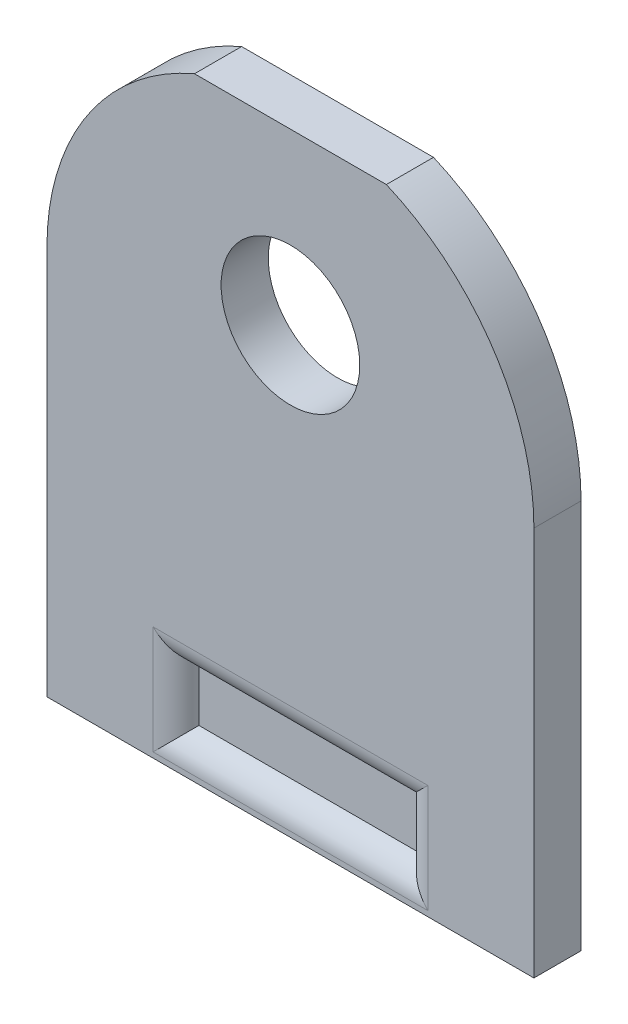
ISO-10303-21;
HEADER;
FILE_DESCRIPTION(('STEP AP214'),'2;1');
FILE_NAME('part.step','',(''),(''),'','','');
FILE_SCHEMA(('AUTOMOTIVE_DESIGN { 1 0 10303 214 1 1 1 1 }'));
ENDSEC;
DATA;
#1=APPLICATION_CONTEXT('core data for automotive mechanical design processes');
#2=APPLICATION_PROTOCOL_DEFINITION('international standard','automotive_design',2000,#1);
#3=PRODUCT_CONTEXT('',#1,'mechanical');
#4=PRODUCT('Part','Part','',(#3));
#5=PRODUCT_RELATED_PRODUCT_CATEGORY('part','',(#4));
#6=PRODUCT_DEFINITION_FORMATION('','',#4);
#7=PRODUCT_DEFINITION_CONTEXT('part definition',#1,'design');
#8=PRODUCT_DEFINITION('design','',#6,#7);
#9=PRODUCT_DEFINITION_SHAPE('','',#8);
#10=(LENGTH_UNIT() NAMED_UNIT(*) SI_UNIT(.MILLI.,.METRE.));
#11=(NAMED_UNIT(*) PLANE_ANGLE_UNIT() SI_UNIT($,.RADIAN.));
#12=(NAMED_UNIT(*) SI_UNIT($,.STERADIAN.) SOLID_ANGLE_UNIT());
#13=UNCERTAINTY_MEASURE_WITH_UNIT(LENGTH_MEASURE(1.E-05),#10,'distance_accuracy_value','');
#14=(GEOMETRIC_REPRESENTATION_CONTEXT(3) GLOBAL_UNCERTAINTY_ASSIGNED_CONTEXT((#13)) GLOBAL_UNIT_ASSIGNED_CONTEXT((#10,
#11,#12)) REPRESENTATION_CONTEXT('',''));
#15=CARTESIAN_POINT('',(0.,0.,0.));
#16=DIRECTION('',(0.,0.,1.));
#17=DIRECTION('',(1.,0.,0.));
#18=AXIS2_PLACEMENT_3D('',#15,#16,#17);
#19=CARTESIAN_POINT('',(8.78,6.55,1.7));
#20=DIRECTION('',(0.,0.,-1.));
#21=DIRECTION('',(-1.,0.,0.));
#22=AXIS2_PLACEMENT_3D('',#19,#20,#21);
#23=CYLINDRICAL_SURFACE('',#22,8.78);
#24=CARTESIAN_POINT('',(8.78,6.55,1.7));
#25=DIRECTION('',(0.,0.,1.));
#26=DIRECTION('',(1.,0.,0.));
#27=AXIS2_PLACEMENT_3D('',#24,#25,#26);
#28=CIRCLE('',#27,8.78);
#29=CARTESIAN_POINT('',(5.32,14.6194981256581,1.7));
#30=VERTEX_POINT('',#29);
#31=CARTESIAN_POINT('',(0.,6.55,1.7));
#32=VERTEX_POINT('',#31);
#33=EDGE_CURVE('E162',#30,#32,#28,.T.);
#34=ORIENTED_EDGE('',*,*,#33,.F.);
#35=DIRECTION('',(0.,0.,1.));
#36=VECTOR('',#35,1.);
#37=CARTESIAN_POINT('',(5.32,14.6194981256581,0.));
#38=LINE('',#37,#36);
#39=CARTESIAN_POINT('',(5.32,14.6194981256581,0.));
#40=VERTEX_POINT('',#39);
#41=EDGE_CURVE('E152',#40,#30,#38,.T.);
#42=ORIENTED_EDGE('',*,*,#41,.F.);
#43=CARTESIAN_POINT('',(8.78,6.55,0.));
#44=DIRECTION('',(0.,0.,1.));
#45=DIRECTION('',(1.,0.,0.));
#46=AXIS2_PLACEMENT_3D('',#43,#44,#45);
#47=CIRCLE('',#46,8.78);
#48=CARTESIAN_POINT('',(0.,6.55,0.));
#49=VERTEX_POINT('',#48);
#50=EDGE_CURVE('E176',#40,#49,#47,.T.);
#51=ORIENTED_EDGE('',*,*,#50,.T.);
#52=DIRECTION('',(0.,0.,-1.));
#53=VECTOR('',#52,1.);
#54=CARTESIAN_POINT('',(0.,6.55,1.7));
#55=LINE('',#54,#53);
#56=EDGE_CURVE('E173',#32,#49,#55,.T.);
#57=ORIENTED_EDGE('',*,*,#56,.F.);
#58=EDGE_LOOP('',(#34,#42,#51,#57));
#59=FACE_BOUND('',#58,.T.);
#60=ADVANCED_FACE('F34',(#59),#23,.T.);
#61=CARTESIAN_POINT('',(17.56,0.,1.7));
#62=DIRECTION('',(-1.,0.,0.));
#63=DIRECTION('',(0.,0.,1.));
#64=AXIS2_PLACEMENT_3D('',#61,#62,#63);
#65=PLANE('',#64);
#66=DIRECTION('',(0.,1.,0.));
#67=VECTOR('',#66,1.);
#68=CARTESIAN_POINT('',(17.56,0.,0.));
#69=LINE('',#68,#67);
#70=CARTESIAN_POINT('',(17.56,-7.5,0.));
#71=VERTEX_POINT('',#70);
#72=CARTESIAN_POINT('',(17.56,6.55,0.));
#73=VERTEX_POINT('',#72);
#74=EDGE_CURVE('E157',#71,#73,#69,.T.);
#75=ORIENTED_EDGE('',*,*,#74,.T.);
#76=DIRECTION('',(0.,0.,-1.));
#77=VECTOR('',#76,1.);
#78=CARTESIAN_POINT('',(17.56,6.55,1.7));
#79=LINE('',#78,#77);
#80=CARTESIAN_POINT('',(17.56,6.55,1.7));
#81=VERTEX_POINT('',#80);
#82=EDGE_CURVE('E187',#81,#73,#79,.T.);
#83=ORIENTED_EDGE('',*,*,#82,.F.);
#84=DIRECTION('',(0.,1.,0.));
#85=VECTOR('',#84,1.);
#86=CARTESIAN_POINT('',(17.56,0.,1.7));
#87=LINE('',#86,#85);
#88=CARTESIAN_POINT('',(17.56,-7.5,1.7));
#89=VERTEX_POINT('',#88);
#90=EDGE_CURVE('E159',#89,#81,#87,.T.);
#91=ORIENTED_EDGE('',*,*,#90,.F.);
#92=DIRECTION('',(0.,0.,1.));
#93=VECTOR('',#92,1.);
#94=CARTESIAN_POINT('',(17.56,-7.5,0.));
#95=LINE('',#94,#93);
#96=EDGE_CURVE('E142',#71,#89,#95,.T.);
#97=ORIENTED_EDGE('',*,*,#96,.F.);
#98=EDGE_LOOP('',(#75,#83,#91,#97));
#99=FACE_BOUND('',#98,.T.);
#100=ADVANCED_FACE('F208',(#99),#65,.F.);
#101=CARTESIAN_POINT('',(12.24,14.6194981256581,0.));
#102=VERTEX_POINT('',#101);
#103=EDGE_CURVE('E177',#73,#102,#47,.T.);
#104=ORIENTED_EDGE('',*,*,#103,.T.);
#105=DIRECTION('',(0.,0.,1.));
#106=VECTOR('',#105,1.);
#107=CARTESIAN_POINT('',(12.24,14.6194981256581,0.));
#108=LINE('',#107,#106);
#109=CARTESIAN_POINT('',(12.24,14.6194981256581,1.7));
#110=VERTEX_POINT('',#109);
#111=EDGE_CURVE('E154',#102,#110,#108,.T.);
#112=ORIENTED_EDGE('',*,*,#111,.T.);
#113=EDGE_CURVE('E164',#81,#110,#28,.T.);
#114=ORIENTED_EDGE('',*,*,#113,.F.);
#115=ORIENTED_EDGE('',*,*,#82,.T.);
#116=EDGE_LOOP('',(#104,#112,#114,#115));
#117=FACE_BOUND('',#116,.T.);
#118=ADVANCED_FACE('F211',(#117),#23,.T.);
#119=CARTESIAN_POINT('',(0.,0.,1.7));
#120=DIRECTION('',(-1.,0.,0.));
#121=DIRECTION('',(0.,0.,1.));
#122=AXIS2_PLACEMENT_3D('',#119,#120,#121);
#123=PLANE('',#122);
#124=DIRECTION('',(0.,1.,0.));
#125=VECTOR('',#124,1.);
#126=CARTESIAN_POINT('',(0.,0.,0.));
#127=LINE('',#126,#125);
#128=CARTESIAN_POINT('',(0.,-7.5,0.));
#129=VERTEX_POINT('',#128);
#130=EDGE_CURVE('E180',#129,#49,#127,.T.);
#131=ORIENTED_EDGE('',*,*,#130,.F.);
#132=DIRECTION('',(0.,0.,-1.));
#133=VECTOR('',#132,1.);
#134=CARTESIAN_POINT('',(0.,-7.5,1.7));
#135=LINE('',#134,#133);
#136=CARTESIAN_POINT('',(0.,-7.5,1.7));
#137=VERTEX_POINT('',#136);
#138=EDGE_CURVE('E136',#137,#129,#135,.T.);
#139=ORIENTED_EDGE('',*,*,#138,.F.);
#140=DIRECTION('',(0.,1.,0.));
#141=VECTOR('',#140,1.);
#142=CARTESIAN_POINT('',(0.,0.,1.7));
#143=LINE('',#142,#141);
#144=EDGE_CURVE('E167',#137,#32,#143,.T.);
#145=ORIENTED_EDGE('',*,*,#144,.T.);
#146=ORIENTED_EDGE('',*,*,#56,.T.);
#147=EDGE_LOOP('',(#131,#139,#145,#146));
#148=FACE_BOUND('',#147,.T.);
#149=ADVANCED_FACE('F220',(#148),#123,.T.);
#150=CARTESIAN_POINT('',(8.78,8.5,1.7));
#151=DIRECTION('',(0.,0.,-1.));
#152=DIRECTION('',(-1.,0.,0.));
#153=AXIS2_PLACEMENT_3D('',#150,#151,#152);
#154=CYLINDRICAL_SURFACE('',#153,2.5);
#155=CARTESIAN_POINT('',(8.78,8.5,1.7));
#156=DIRECTION('',(0.,0.,1.));
#157=DIRECTION('',(1.,0.,0.));
#158=AXIS2_PLACEMENT_3D('',#155,#156,#157);
#159=CIRCLE('',#158,2.5);
#160=CARTESIAN_POINT('',(11.28,8.5,1.7));
#161=VERTEX_POINT('',#160);
#162=EDGE_CURVE('E170',#161,#161,#159,.T.);
#163=ORIENTED_EDGE('',*,*,#162,.T.);
#164=EDGE_LOOP('',(#163));
#165=FACE_BOUND('',#164,.T.);
#166=CARTESIAN_POINT('',(8.78,8.5,0.));
#167=DIRECTION('',(0.,0.,1.));
#168=DIRECTION('',(1.,0.,0.));
#169=AXIS2_PLACEMENT_3D('',#166,#167,#168);
#170=CIRCLE('',#169,2.5);
#171=CARTESIAN_POINT('',(11.28,8.5,0.));
#172=VERTEX_POINT('',#171);
#173=EDGE_CURVE('E163',#172,#172,#170,.T.);
#174=ORIENTED_EDGE('',*,*,#173,.F.);
#175=EDGE_LOOP('',(#174));
#176=FACE_BOUND('',#175,.T.);
#177=ADVANCED_FACE('F225',(#165,#176),#154,.F.);
#178=CARTESIAN_POINT('',(0.,0.,1.7));
#179=DIRECTION('',(0.,0.,1.));
#180=DIRECTION('',(1.,0.,0.));
#181=AXIS2_PLACEMENT_3D('',#178,#179,#180);
#182=PLANE('',#181);
#183=DIRECTION('',(-1.,0.,0.));
#184=VECTOR('',#183,1.);
#185=CARTESIAN_POINT('',(12.78,-3.39922763003554,1.7));
#186=LINE('',#185,#184);
#187=CARTESIAN_POINT('',(3.82606079858305,-3.39922763003554,1.7));
#188=VERTEX_POINT('',#187);
#189=CARTESIAN_POINT('',(13.7339392014169,-3.39922763003554,1.7));
#190=VERTEX_POINT('',#189);
#191=EDGE_CURVE('E190',#188,#190,#186,.F.);
#192=ORIENTED_EDGE('',*,*,#191,.T.);
#193=DIRECTION('',(0.,1.,0.));
#194=VECTOR('',#193,1.);
#195=CARTESIAN_POINT('',(13.7339392014169,-6.35316683145248,1.7));
#196=LINE('',#195,#194);
#197=CARTESIAN_POINT('',(13.7339392014169,-7.30710603286943,1.7));
#198=VERTEX_POINT('',#197);
#199=EDGE_CURVE('E11',#190,#198,#196,.F.);
#200=ORIENTED_EDGE('',*,*,#199,.T.);
#201=DIRECTION('',(1.,0.,0.));
#202=VECTOR('',#201,1.);
#203=CARTESIAN_POINT('',(4.78,-7.30710603286943,1.7));
#204=LINE('',#203,#202);
#205=CARTESIAN_POINT('',(3.82606079858305,-7.30710603286943,1.7));
#206=VERTEX_POINT('',#205);
#207=EDGE_CURVE('E43',#198,#206,#204,.F.);
#208=ORIENTED_EDGE('',*,*,#207,.T.);
#209=DIRECTION('',(0.,-1.,0.));
#210=VECTOR('',#209,1.);
#211=CARTESIAN_POINT('',(3.82606079858305,-4.35316683145248,1.7));
#212=LINE('',#211,#210);
#213=EDGE_CURVE('E192',#206,#188,#212,.F.);
#214=ORIENTED_EDGE('',*,*,#213,.T.);
#215=EDGE_LOOP('',(#192,#200,#208,#214));
#216=FACE_BOUND('',#215,.T.);
#217=DIRECTION('',(1.,0.,0.));
#218=VECTOR('',#217,1.);
#219=CARTESIAN_POINT('',(0.,14.6194981256581,1.7));
#220=LINE('',#219,#218);
#221=EDGE_CURVE('E148',#30,#110,#220,.T.);
#222=ORIENTED_EDGE('',*,*,#221,.F.);
#223=ORIENTED_EDGE('',*,*,#33,.T.);
#224=ORIENTED_EDGE('',*,*,#144,.F.);
#225=DIRECTION('',(-1.,0.,0.));
#226=VECTOR('',#225,1.);
#227=CARTESIAN_POINT('',(17.56,-7.5,1.7));
#228=LINE('',#227,#226);
#229=EDGE_CURVE('E145',#89,#137,#228,.T.);
#230=ORIENTED_EDGE('',*,*,#229,.F.);
#231=ORIENTED_EDGE('',*,*,#90,.T.);
#232=ORIENTED_EDGE('',*,*,#113,.T.);
#233=EDGE_LOOP('',(#222,#223,#224,#230,#231,#232));
#234=FACE_BOUND('',#233,.T.);
#235=ORIENTED_EDGE('',*,*,#162,.F.);
#236=EDGE_LOOP('',(#235));
#237=FACE_BOUND('',#236,.T.);
#238=ADVANCED_FACE('F195',(#216,#234,#237),#182,.T.);
#239=CARTESIAN_POINT('',(0.,0.,0.));
#240=DIRECTION('',(0.,0.,1.));
#241=DIRECTION('',(1.,0.,0.));
#242=AXIS2_PLACEMENT_3D('',#239,#240,#241);
#243=PLANE('',#242);
#244=ORIENTED_EDGE('',*,*,#50,.F.);
#245=DIRECTION('',(1.,0.,0.));
#246=VECTOR('',#245,1.);
#247=CARTESIAN_POINT('',(0.,14.6194981256581,0.));
#248=LINE('',#247,#246);
#249=EDGE_CURVE('E149',#40,#102,#248,.T.);
#250=ORIENTED_EDGE('',*,*,#249,.T.);
#251=ORIENTED_EDGE('',*,*,#103,.F.);
#252=ORIENTED_EDGE('',*,*,#74,.F.);
#253=DIRECTION('',(1.,0.,0.));
#254=VECTOR('',#253,1.);
#255=CARTESIAN_POINT('',(0.,-7.5,0.));
#256=LINE('',#255,#254);
#257=EDGE_CURVE('E139',#129,#71,#256,.T.);
#258=ORIENTED_EDGE('',*,*,#257,.F.);
#259=ORIENTED_EDGE('',*,*,#130,.T.);
#260=EDGE_LOOP('',(#244,#250,#251,#252,#258,#259));
#261=FACE_BOUND('',#260,.T.);
#262=ORIENTED_EDGE('',*,*,#173,.T.);
#263=EDGE_LOOP('',(#262));
#264=FACE_BOUND('',#263,.T.);
#265=ADVANCED_FACE('F230',(#261,#264),#243,.F.);
#266=CARTESIAN_POINT('',(0.,14.6194981256581,0.));
#267=DIRECTION('',(0.,-1.,0.));
#268=DIRECTION('',(0.,0.,-1.));
#269=AXIS2_PLACEMENT_3D('',#266,#267,#268);
#270=PLANE('',#269);
#271=ORIENTED_EDGE('',*,*,#221,.T.);
#272=ORIENTED_EDGE('',*,*,#111,.F.);
#273=ORIENTED_EDGE('',*,*,#249,.F.);
#274=ORIENTED_EDGE('',*,*,#41,.T.);
#275=EDGE_LOOP('',(#271,#272,#273,#274));
#276=FACE_BOUND('',#275,.T.);
#277=ADVANCED_FACE('F235',(#276),#270,.F.);
#278=CARTESIAN_POINT('',(0.,-7.5,0.));
#279=DIRECTION('',(0.,-1.,0.));
#280=DIRECTION('',(0.,0.,-1.));
#281=AXIS2_PLACEMENT_3D('',#278,#279,#280);
#282=PLANE('',#281);
#283=ORIENTED_EDGE('',*,*,#138,.T.);
#284=ORIENTED_EDGE('',*,*,#257,.T.);
#285=ORIENTED_EDGE('',*,*,#96,.T.);
#286=ORIENTED_EDGE('',*,*,#229,.T.);
#287=EDGE_LOOP('',(#283,#284,#285,#286));
#288=FACE_BOUND('',#287,.T.);
#289=ADVANCED_FACE('F242',(#288),#282,.T.);
#290=CARTESIAN_POINT('',(0.,0.,1.));
#291=DIRECTION('',(0.,0.,1.));
#292=DIRECTION('',(1.,0.,0.));
#293=AXIS2_PLACEMENT_3D('',#290,#291,#292);
#294=PLANE('',#293);
#295=DIRECTION('',(0.,1.,0.));
#296=VECTOR('',#295,1.);
#297=CARTESIAN_POINT('',(12.78,-6.35316683145248,1.));
#298=LINE('',#297,#296);
#299=CARTESIAN_POINT('',(12.78,-6.35316683145248,1.));
#300=VERTEX_POINT('',#299);
#301=CARTESIAN_POINT('',(12.78,-4.35316683145248,1.));
#302=VERTEX_POINT('',#301);
#303=EDGE_CURVE('E115',#300,#302,#298,.T.);
#304=ORIENTED_EDGE('',*,*,#303,.T.);
#305=DIRECTION('',(-1.,0.,0.));
#306=VECTOR('',#305,1.);
#307=CARTESIAN_POINT('',(12.78,-4.35316683145248,1.));
#308=LINE('',#307,#306);
#309=CARTESIAN_POINT('',(4.78,-4.35316683145248,1.));
#310=VERTEX_POINT('',#309);
#311=EDGE_CURVE('E120',#302,#310,#308,.T.);
#312=ORIENTED_EDGE('',*,*,#311,.T.);
#313=DIRECTION('',(0.,-1.,0.));
#314=VECTOR('',#313,1.);
#315=CARTESIAN_POINT('',(4.78,-6.35316683145248,1.));
#316=LINE('',#315,#314);
#317=CARTESIAN_POINT('',(4.78,-6.35316683145248,1.));
#318=VERTEX_POINT('',#317);
#319=EDGE_CURVE('E126',#310,#318,#316,.T.);
#320=ORIENTED_EDGE('',*,*,#319,.T.);
#321=DIRECTION('',(1.,0.,0.));
#322=VECTOR('',#321,1.);
#323=CARTESIAN_POINT('',(12.78,-6.35316683145248,1.));
#324=LINE('',#323,#322);
#325=EDGE_CURVE('E130',#318,#300,#324,.T.);
#326=ORIENTED_EDGE('',*,*,#325,.T.);
#327=EDGE_LOOP('',(#304,#312,#320,#326));
#328=FACE_BOUND('',#327,.T.);
#329=ADVANCED_FACE('F128',(#328),#294,.T.);
#330=CARTESIAN_POINT('',(3.82606079858305,-6.35316683145248,0.7));
#331=DIRECTION('',(0.,1.,0.));
#332=DIRECTION('',(0.,0.,1.));
#333=AXIS2_PLACEMENT_3D('',#330,#331,#332);
#334=CYLINDRICAL_SURFACE('',#333,1.);
#335=CARTESIAN_POINT('',(3.82606079858305,-3.39922763003554,0.7));
#336=DIRECTION('',(0.707106781186547,0.707106781186547,0.));
#337=DIRECTION('',(-0.707106781186547,0.707106781186547,0.));
#338=AXIS2_PLACEMENT_3D('',#335,#336,#337);
#339=ELLIPSE('',#338,1.41421356237309,1.);
#340=EDGE_CURVE('E123',#188,#310,#339,.T.);
#341=ORIENTED_EDGE('',*,*,#340,.F.);
#342=ORIENTED_EDGE('',*,*,#213,.F.);
#343=CARTESIAN_POINT('',(3.82606079858305,-7.30710603286943,0.7));
#344=DIRECTION('',(-0.707106781186548,0.707106781186547,0.));
#345=DIRECTION('',(-0.707106781186547,-0.707106781186548,0.));
#346=AXIS2_PLACEMENT_3D('',#343,#344,#345);
#347=ELLIPSE('',#346,1.4142135623731,1.);
#348=EDGE_CURVE('E38',#318,#206,#347,.F.);
#349=ORIENTED_EDGE('',*,*,#348,.F.);
#350=ORIENTED_EDGE('',*,*,#319,.F.);
#351=EDGE_LOOP('',(#341,#342,#349,#350));
#352=FACE_BOUND('',#351,.T.);
#353=ADVANCED_FACE('F36',(#352),#334,.T.);
#354=CARTESIAN_POINT('',(12.78,-7.30710603286943,0.7));
#355=DIRECTION('',(-1.,0.,0.));
#356=DIRECTION('',(0.,-1.,0.));
#357=AXIS2_PLACEMENT_3D('',#354,#355,#356);
#358=CYLINDRICAL_SURFACE('',#357,1.);
#359=ORIENTED_EDGE('',*,*,#348,.T.);
#360=ORIENTED_EDGE('',*,*,#207,.F.);
#361=CARTESIAN_POINT('',(13.7339392014169,-7.30710603286943,0.7));
#362=DIRECTION('',(-0.707106781186547,-0.707106781186548,0.));
#363=DIRECTION('',(0.707106781186548,-0.707106781186547,0.));
#364=AXIS2_PLACEMENT_3D('',#361,#362,#363);
#365=ELLIPSE('',#364,1.41421356237309,1.);
#366=EDGE_CURVE('E51',#300,#198,#365,.F.);
#367=ORIENTED_EDGE('',*,*,#366,.F.);
#368=ORIENTED_EDGE('',*,*,#325,.F.);
#369=EDGE_LOOP('',(#359,#360,#367,#368));
#370=FACE_BOUND('',#369,.T.);
#371=ADVANCED_FACE('F200',(#370),#358,.T.);
#372=CARTESIAN_POINT('',(12.78,-3.39922763003554,0.7));
#373=DIRECTION('',(1.,0.,0.));
#374=DIRECTION('',(0.,0.,-1.));
#375=AXIS2_PLACEMENT_3D('',#372,#373,#374);
#376=CYLINDRICAL_SURFACE('',#375,1.);
#377=ORIENTED_EDGE('',*,*,#340,.T.);
#378=ORIENTED_EDGE('',*,*,#311,.F.);
#379=CARTESIAN_POINT('',(13.7339392014169,-3.39922763003554,0.7));
#380=DIRECTION('',(0.707106781186547,-0.707106781186547,0.));
#381=DIRECTION('',(-0.707106781186547,-0.707106781186547,0.));
#382=AXIS2_PLACEMENT_3D('',#379,#380,#381);
#383=ELLIPSE('',#382,1.41421356237309,1.);
#384=EDGE_CURVE('E111',#190,#302,#383,.T.);
#385=ORIENTED_EDGE('',*,*,#384,.F.);
#386=ORIENTED_EDGE('',*,*,#191,.F.);
#387=EDGE_LOOP('',(#377,#378,#385,#386));
#388=FACE_BOUND('',#387,.T.);
#389=ADVANCED_FACE('F121',(#388),#376,.T.);
#390=CARTESIAN_POINT('',(13.7339392014169,-6.35316683145248,0.7));
#391=DIRECTION('',(0.,-1.,0.));
#392=DIRECTION('',(0.,0.,-1.));
#393=AXIS2_PLACEMENT_3D('',#390,#391,#392);
#394=CYLINDRICAL_SURFACE('',#393,1.);
#395=ORIENTED_EDGE('',*,*,#366,.T.);
#396=ORIENTED_EDGE('',*,*,#199,.F.);
#397=ORIENTED_EDGE('',*,*,#384,.T.);
#398=ORIENTED_EDGE('',*,*,#303,.F.);
#399=EDGE_LOOP('',(#395,#396,#397,#398));
#400=FACE_BOUND('',#399,.T.);
#401=ADVANCED_FACE('F113',(#400),#394,.T.);
#402=CLOSED_SHELL('',(#60,#100,#118,#149,#177,#238,#265,#277,#289,#329,#353,#371,#389,#401));
#403=MANIFOLD_SOLID_BREP('B2',#402);
#404=ADVANCED_BREP_SHAPE_REPRESENTATION('',(#18,#403),#14);
#405=SHAPE_DEFINITION_REPRESENTATION(#9,#404);
ENDSEC;
END-ISO-10303-21;
